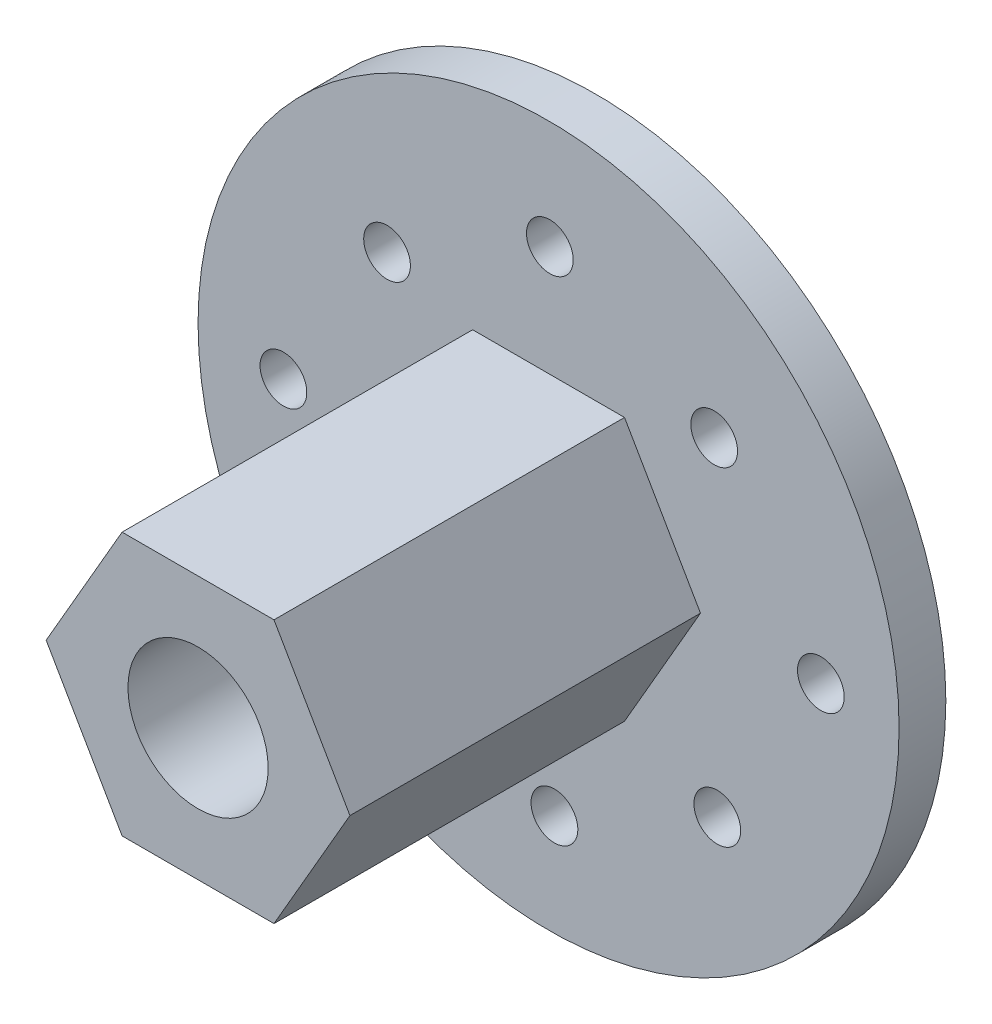
ISO-10303-21;
HEADER;
FILE_DESCRIPTION(('STEP AP214'),'2;1');
FILE_NAME('part.step','',(''),(''),'','','');
FILE_SCHEMA(('AUTOMOTIVE_DESIGN { 1 0 10303 214 1 1 1 1 }'));
ENDSEC;
DATA;
#1=APPLICATION_CONTEXT('core data for automotive mechanical design processes');
#2=APPLICATION_PROTOCOL_DEFINITION('international standard','automotive_design',2000,#1);
#3=PRODUCT_CONTEXT('',#1,'mechanical');
#4=PRODUCT('Part','Part','',(#3));
#5=PRODUCT_RELATED_PRODUCT_CATEGORY('part','',(#4));
#6=PRODUCT_DEFINITION_FORMATION('','',#4);
#7=PRODUCT_DEFINITION_CONTEXT('part definition',#1,'design');
#8=PRODUCT_DEFINITION('design','',#6,#7);
#9=PRODUCT_DEFINITION_SHAPE('','',#8);
#10=(LENGTH_UNIT() NAMED_UNIT(*) SI_UNIT(.MILLI.,.METRE.));
#11=(NAMED_UNIT(*) PLANE_ANGLE_UNIT() SI_UNIT($,.RADIAN.));
#12=(NAMED_UNIT(*) SI_UNIT($,.STERADIAN.) SOLID_ANGLE_UNIT());
#13=UNCERTAINTY_MEASURE_WITH_UNIT(LENGTH_MEASURE(1.E-05),#10,'distance_accuracy_value','');
#14=(GEOMETRIC_REPRESENTATION_CONTEXT(3) GLOBAL_UNCERTAINTY_ASSIGNED_CONTEXT((#13)) GLOBAL_UNIT_ASSIGNED_CONTEXT((#10,
#11,#12)) REPRESENTATION_CONTEXT('',''));
#15=CARTESIAN_POINT('',(0.,0.,0.));
#16=DIRECTION('',(0.,0.,1.));
#17=DIRECTION('',(1.,0.,0.));
#18=AXIS2_PLACEMENT_3D('',#15,#16,#17);
#19=CARTESIAN_POINT('',(0.,-5.62916512459885,15.));
#20=DIRECTION('',(0.,1.,0.));
#21=DIRECTION('',(-1.,0.,0.));
#22=AXIS2_PLACEMENT_3D('',#19,#20,#21);
#23=PLANE('',#22);
#24=DIRECTION('',(1.,0.,0.));
#25=VECTOR('',#24,1.);
#26=CARTESIAN_POINT('',(0.,-5.62916512459885,0.));
#27=LINE('',#26,#25);
#28=CARTESIAN_POINT('',(-3.25,-5.62916512459885,0.));
#29=VERTEX_POINT('',#28);
#30=CARTESIAN_POINT('',(3.25,-5.62916512459885,0.));
#31=VERTEX_POINT('',#30);
#32=EDGE_CURVE('E90',#29,#31,#27,.T.);
#33=ORIENTED_EDGE('',*,*,#32,.T.);
#34=DIRECTION('',(0.,0.,-1.));
#35=VECTOR('',#34,1.);
#36=CARTESIAN_POINT('',(3.25,-5.62916512459885,15.));
#37=LINE('',#36,#35);
#38=CARTESIAN_POINT('',(3.25,-5.62916512459885,15.));
#39=VERTEX_POINT('',#38);
#40=EDGE_CURVE('E11',#39,#31,#37,.T.);
#41=ORIENTED_EDGE('',*,*,#40,.F.);
#42=DIRECTION('',(1.,0.,0.));
#43=VECTOR('',#42,1.);
#44=CARTESIAN_POINT('',(0.,-5.62916512459885,15.));
#45=LINE('',#44,#43);
#46=CARTESIAN_POINT('',(-3.25,-5.62916512459885,15.));
#47=VERTEX_POINT('',#46);
#48=EDGE_CURVE('E142',#47,#39,#45,.T.);
#49=ORIENTED_EDGE('',*,*,#48,.F.);
#50=DIRECTION('',(0.,0.,-1.));
#51=VECTOR('',#50,1.);
#52=CARTESIAN_POINT('',(-3.25,-5.62916512459885,15.));
#53=LINE('',#52,#51);
#54=EDGE_CURVE('E104',#47,#29,#53,.T.);
#55=ORIENTED_EDGE('',*,*,#54,.T.);
#56=EDGE_LOOP('',(#33,#41,#49,#55));
#57=FACE_BOUND('',#56,.T.);
#58=ADVANCED_FACE('F37',(#57),#23,.F.);
#59=CARTESIAN_POINT('',(4.875,-2.81458256229943,15.));
#60=DIRECTION('',(-0.866025403784439,0.5,0.));
#61=DIRECTION('',(-0.5,-0.866025403784439,0.));
#62=AXIS2_PLACEMENT_3D('',#59,#60,#61);
#63=PLANE('',#62);
#64=DIRECTION('',(0.5,0.866025403784439,0.));
#65=VECTOR('',#64,1.);
#66=CARTESIAN_POINT('',(4.875,-2.81458256229943,0.));
#67=LINE('',#66,#65);
#68=CARTESIAN_POINT('',(6.5,0.,0.));
#69=VERTEX_POINT('',#68);
#70=EDGE_CURVE('E86',#31,#69,#67,.T.);
#71=ORIENTED_EDGE('',*,*,#70,.T.);
#72=DIRECTION('',(0.,0.,-1.));
#73=VECTOR('',#72,1.);
#74=CARTESIAN_POINT('',(6.5,0.,15.));
#75=LINE('',#74,#73);
#76=CARTESIAN_POINT('',(6.5,0.,15.));
#77=VERTEX_POINT('',#76);
#78=EDGE_CURVE('E46',#77,#69,#75,.T.);
#79=ORIENTED_EDGE('',*,*,#78,.F.);
#80=DIRECTION('',(0.5,0.866025403784439,0.));
#81=VECTOR('',#80,1.);
#82=CARTESIAN_POINT('',(4.875,-2.81458256229943,15.));
#83=LINE('',#82,#81);
#84=EDGE_CURVE('E100',#39,#77,#83,.T.);
#85=ORIENTED_EDGE('',*,*,#84,.F.);
#86=ORIENTED_EDGE('',*,*,#40,.T.);
#87=EDGE_LOOP('',(#71,#79,#85,#86));
#88=FACE_BOUND('',#87,.T.);
#89=ADVANCED_FACE('F99',(#88),#63,.F.);
#90=CARTESIAN_POINT('',(4.875,2.81458256229943,15.));
#91=DIRECTION('',(-0.866025403784439,-0.5,0.));
#92=DIRECTION('',(0.5,-0.866025403784439,0.));
#93=AXIS2_PLACEMENT_3D('',#90,#91,#92);
#94=PLANE('',#93);
#95=DIRECTION('',(-0.5,0.866025403784439,0.));
#96=VECTOR('',#95,1.);
#97=CARTESIAN_POINT('',(4.875,2.81458256229943,0.));
#98=LINE('',#97,#96);
#99=CARTESIAN_POINT('',(3.25,5.62916512459885,0.));
#100=VERTEX_POINT('',#99);
#101=EDGE_CURVE('E93',#69,#100,#98,.T.);
#102=ORIENTED_EDGE('',*,*,#101,.T.);
#103=DIRECTION('',(0.,0.,-1.));
#104=VECTOR('',#103,1.);
#105=CARTESIAN_POINT('',(3.25,5.62916512459885,15.));
#106=LINE('',#105,#104);
#107=CARTESIAN_POINT('',(3.25,5.62916512459885,15.));
#108=VERTEX_POINT('',#107);
#109=EDGE_CURVE('E130',#108,#100,#106,.T.);
#110=ORIENTED_EDGE('',*,*,#109,.F.);
#111=DIRECTION('',(-0.5,0.866025403784439,0.));
#112=VECTOR('',#111,1.);
#113=CARTESIAN_POINT('',(4.875,2.81458256229943,15.));
#114=LINE('',#113,#112);
#115=EDGE_CURVE('E136',#77,#108,#114,.T.);
#116=ORIENTED_EDGE('',*,*,#115,.F.);
#117=ORIENTED_EDGE('',*,*,#78,.T.);
#118=EDGE_LOOP('',(#102,#110,#116,#117));
#119=FACE_BOUND('',#118,.T.);
#120=ADVANCED_FACE('F134',(#119),#94,.F.);
#121=CARTESIAN_POINT('',(0.,5.62916512459885,15.));
#122=DIRECTION('',(0.,-1.,0.));
#123=DIRECTION('',(1.,0.,0.));
#124=AXIS2_PLACEMENT_3D('',#121,#122,#123);
#125=PLANE('',#124);
#126=DIRECTION('',(-1.,0.,0.));
#127=VECTOR('',#126,1.);
#128=CARTESIAN_POINT('',(0.,5.62916512459885,0.));
#129=LINE('',#128,#127);
#130=CARTESIAN_POINT('',(-3.25,5.62916512459886,0.));
#131=VERTEX_POINT('',#130);
#132=EDGE_CURVE('E114',#100,#131,#129,.T.);
#133=ORIENTED_EDGE('',*,*,#132,.T.);
#134=DIRECTION('',(0.,0.,-1.));
#135=VECTOR('',#134,1.);
#136=CARTESIAN_POINT('',(-3.25,5.62916512459886,15.));
#137=LINE('',#136,#135);
#138=CARTESIAN_POINT('',(-3.25,5.62916512459886,15.));
#139=VERTEX_POINT('',#138);
#140=EDGE_CURVE('E127',#139,#131,#137,.T.);
#141=ORIENTED_EDGE('',*,*,#140,.F.);
#142=DIRECTION('',(-1.,0.,0.));
#143=VECTOR('',#142,1.);
#144=CARTESIAN_POINT('',(0.,5.62916512459885,15.));
#145=LINE('',#144,#143);
#146=EDGE_CURVE('E138',#108,#139,#145,.T.);
#147=ORIENTED_EDGE('',*,*,#146,.F.);
#148=ORIENTED_EDGE('',*,*,#109,.T.);
#149=EDGE_LOOP('',(#133,#141,#147,#148));
#150=FACE_BOUND('',#149,.T.);
#151=ADVANCED_FACE('F236',(#150),#125,.F.);
#152=CARTESIAN_POINT('',(-4.875,2.81458256229943,15.));
#153=DIRECTION('',(0.866025403784439,-0.5,0.));
#154=DIRECTION('',(0.5,0.866025403784439,0.));
#155=AXIS2_PLACEMENT_3D('',#152,#153,#154);
#156=PLANE('',#155);
#157=DIRECTION('',(-0.5,-0.866025403784439,0.));
#158=VECTOR('',#157,1.);
#159=CARTESIAN_POINT('',(-4.875,2.81458256229943,0.));
#160=LINE('',#159,#158);
#161=CARTESIAN_POINT('',(-6.5,0.,0.));
#162=VERTEX_POINT('',#161);
#163=EDGE_CURVE('E117',#131,#162,#160,.T.);
#164=ORIENTED_EDGE('',*,*,#163,.T.);
#165=DIRECTION('',(0.,0.,-1.));
#166=VECTOR('',#165,1.);
#167=CARTESIAN_POINT('',(-6.5,0.,15.));
#168=LINE('',#167,#166);
#169=CARTESIAN_POINT('',(-6.5,0.,15.));
#170=VERTEX_POINT('',#169);
#171=EDGE_CURVE('E124',#170,#162,#168,.T.);
#172=ORIENTED_EDGE('',*,*,#171,.F.);
#173=DIRECTION('',(-0.5,-0.866025403784439,0.));
#174=VECTOR('',#173,1.);
#175=CARTESIAN_POINT('',(-4.875,2.81458256229943,15.));
#176=LINE('',#175,#174);
#177=EDGE_CURVE('E140',#139,#170,#176,.T.);
#178=ORIENTED_EDGE('',*,*,#177,.F.);
#179=ORIENTED_EDGE('',*,*,#140,.T.);
#180=EDGE_LOOP('',(#164,#172,#178,#179));
#181=FACE_BOUND('',#180,.T.);
#182=ADVANCED_FACE('F150',(#181),#156,.F.);
#183=CARTESIAN_POINT('',(0.,0.,15.));
#184=DIRECTION('',(0.,0.,-1.));
#185=DIRECTION('',(-1.,0.,0.));
#186=AXIS2_PLACEMENT_3D('',#183,#184,#185);
#187=CYLINDRICAL_SURFACE('',#186,3.);
#188=CARTESIAN_POINT('',(0.,0.,15.));
#189=DIRECTION('',(0.,0.,1.));
#190=DIRECTION('',(1.,0.,0.));
#191=AXIS2_PLACEMENT_3D('',#188,#189,#190);
#192=CIRCLE('',#191,3.);
#193=CARTESIAN_POINT('',(3.,0.,15.));
#194=VERTEX_POINT('',#193);
#195=EDGE_CURVE('E122',#194,#194,#192,.T.);
#196=ORIENTED_EDGE('',*,*,#195,.T.);
#197=EDGE_LOOP('',(#196));
#198=FACE_BOUND('',#197,.T.);
#199=CARTESIAN_POINT('',(0.,0.,-2.));
#200=DIRECTION('',(0.,0.,-1.));
#201=DIRECTION('',(-1.,0.,0.));
#202=AXIS2_PLACEMENT_3D('',#199,#200,#201);
#203=CIRCLE('',#202,3.);
#204=CARTESIAN_POINT('',(-3.,0.,-2.));
#205=VERTEX_POINT('',#204);
#206=EDGE_CURVE('E157',#205,#205,#203,.T.);
#207=ORIENTED_EDGE('',*,*,#206,.T.);
#208=EDGE_LOOP('',(#207));
#209=FACE_BOUND('',#208,.T.);
#210=ADVANCED_FACE('F39',(#198,#209),#187,.F.);
#211=CARTESIAN_POINT('',(-4.875,-2.81458256229943,15.));
#212=DIRECTION('',(0.866025403784439,0.5,0.));
#213=DIRECTION('',(-0.5,0.866025403784439,0.));
#214=AXIS2_PLACEMENT_3D('',#211,#212,#213);
#215=PLANE('',#214);
#216=DIRECTION('',(0.5,-0.866025403784439,0.));
#217=VECTOR('',#216,1.);
#218=CARTESIAN_POINT('',(-4.875,-2.81458256229943,0.));
#219=LINE('',#218,#217);
#220=EDGE_CURVE('E120',#162,#29,#219,.T.);
#221=ORIENTED_EDGE('',*,*,#220,.T.);
#222=ORIENTED_EDGE('',*,*,#54,.F.);
#223=DIRECTION('',(0.5,-0.866025403784439,0.));
#224=VECTOR('',#223,1.);
#225=CARTESIAN_POINT('',(-4.875,-2.81458256229943,15.));
#226=LINE('',#225,#224);
#227=EDGE_CURVE('E53',#170,#47,#226,.T.);
#228=ORIENTED_EDGE('',*,*,#227,.F.);
#229=ORIENTED_EDGE('',*,*,#171,.T.);
#230=EDGE_LOOP('',(#221,#222,#228,#229));
#231=FACE_BOUND('',#230,.T.);
#232=ADVANCED_FACE('F152',(#231),#215,.F.);
#233=CARTESIAN_POINT('',(0.,0.,15.));
#234=DIRECTION('',(0.,0.,1.));
#235=DIRECTION('',(1.,0.,0.));
#236=AXIS2_PLACEMENT_3D('',#233,#234,#235);
#237=PLANE('',#236);
#238=ORIENTED_EDGE('',*,*,#195,.F.);
#239=EDGE_LOOP('',(#238));
#240=FACE_BOUND('',#239,.T.);
#241=ORIENTED_EDGE('',*,*,#48,.T.);
#242=ORIENTED_EDGE('',*,*,#84,.T.);
#243=ORIENTED_EDGE('',*,*,#115,.T.);
#244=ORIENTED_EDGE('',*,*,#146,.T.);
#245=ORIENTED_EDGE('',*,*,#177,.T.);
#246=ORIENTED_EDGE('',*,*,#227,.T.);
#247=EDGE_LOOP('',(#241,#242,#243,#244,#245,#246));
#248=FACE_BOUND('',#247,.T.);
#249=ADVANCED_FACE('F147',(#240,#248),#237,.T.);
#250=CARTESIAN_POINT('',(0.,0.,-2.));
#251=DIRECTION('',(0.,0.,-1.));
#252=DIRECTION('',(-1.,0.,0.));
#253=AXIS2_PLACEMENT_3D('',#250,#251,#252);
#254=PLANE('',#253);
#255=CARTESIAN_POINT('',(11.6522170307561,-0.0320928259493563,-2.));
#256=DIRECTION('',(0.,0.,-1.));
#257=DIRECTION('',(-1.,0.,0.));
#258=AXIS2_PLACEMENT_3D('',#255,#256,#257);
#259=CIRCLE('',#258,1.00000000000001);
#260=CARTESIAN_POINT('',(10.6522170307561,-0.0320928259493563,-2.));
#261=VERTEX_POINT('',#260);
#262=EDGE_CURVE('E195',#261,#261,#259,.T.);
#263=ORIENTED_EDGE('',*,*,#262,.F.);
#264=EDGE_LOOP('',(#263));
#265=FACE_BOUND('',#264,.T.);
#266=CARTESIAN_POINT('',(0.250519229633012,-10.638767200353,-2.));
#267=DIRECTION('',(0.,0.,-1.));
#268=DIRECTION('',(-1.,0.,0.));
#269=AXIS2_PLACEMENT_3D('',#266,#267,#268);
#270=CIRCLE('',#269,1.00000000000001);
#271=CARTESIAN_POINT('',(-0.749480770366994,-10.638767200353,-2.));
#272=VERTEX_POINT('',#271);
#273=EDGE_CURVE('E183',#272,#272,#270,.T.);
#274=ORIENTED_EDGE('',*,*,#273,.F.);
#275=EDGE_LOOP('',(#274));
#276=FACE_BOUND('',#275,.T.);
#277=CARTESIAN_POINT('',(-11.3467825963889,-0.246606579139946,-2.));
#278=DIRECTION('',(0.,0.,-1.));
#279=DIRECTION('',(-1.,0.,0.));
#280=AXIS2_PLACEMENT_3D('',#277,#278,#279);
#281=CIRCLE('',#280,0.999999999999991);
#282=CARTESIAN_POINT('',(-12.3467825963889,-0.246606579139946,-2.));
#283=VERTEX_POINT('',#282);
#284=EDGE_CURVE('E171',#283,#283,#281,.T.);
#285=ORIENTED_EDGE('',*,*,#284,.F.);
#286=EDGE_LOOP('',(#285));
#287=FACE_BOUND('',#286,.T.);
#288=CARTESIAN_POINT('',(0.0546588462850758,10.3603194157364,-2.));
#289=DIRECTION('',(0.,0.,-1.));
#290=DIRECTION('',(-1.,0.,0.));
#291=AXIS2_PLACEMENT_3D('',#288,#289,#290);
#292=CIRCLE('',#291,1.00000000000001);
#293=CARTESIAN_POINT('',(-0.945341153714929,10.3603194157364,-2.));
#294=VERTEX_POINT('',#293);
#295=EDGE_CURVE('E161',#294,#294,#292,.T.);
#296=ORIENTED_EDGE('',*,*,#295,.F.);
#297=EDGE_LOOP('',(#296));
#298=FACE_BOUND('',#297,.T.);
#299=CARTESIAN_POINT('',(0.,0.,-2.));
#300=DIRECTION('',(0.,0.,-1.));
#301=DIRECTION('',(-1.,0.,0.));
#302=AXIS2_PLACEMENT_3D('',#299,#300,#301);
#303=CIRCLE('',#302,15.);
#304=CARTESIAN_POINT('',(-15.,0.,-2.));
#305=VERTEX_POINT('',#304);
#306=EDGE_CURVE('E105',#305,#305,#303,.T.);
#307=ORIENTED_EDGE('',*,*,#306,.T.);
#308=EDGE_LOOP('',(#307));
#309=FACE_BOUND('',#308,.T.);
#310=ORIENTED_EDGE('',*,*,#206,.F.);
#311=EDGE_LOOP('',(#310));
#312=FACE_BOUND('',#311,.T.);
#313=CARTESIAN_POINT('',(-6.91220148410217,6.66790971138448,-2.));
#314=DIRECTION('',(0.,0.,-1.));
#315=DIRECTION('',(-1.,0.,0.));
#316=AXIS2_PLACEMENT_3D('',#313,#314,#315);
#317=CIRCLE('',#316,0.999999999999998);
#318=CARTESIAN_POINT('',(-7.91220148410217,6.66790971138448,-2.));
#319=VERTEX_POINT('',#318);
#320=EDGE_CURVE('E165',#319,#319,#317,.T.);
#321=ORIENTED_EDGE('',*,*,#320,.F.);
#322=EDGE_LOOP('',(#321));
#323=FACE_BOUND('',#322,.T.);
#324=CARTESIAN_POINT('',(-6.77985788851077,-7.33189268353036,-2.));
#325=DIRECTION('',(0.,0.,-1.));
#326=DIRECTION('',(-1.,0.,0.));
#327=AXIS2_PLACEMENT_3D('',#324,#325,#326);
#328=CIRCLE('',#327,1.);
#329=CARTESIAN_POINT('',(-7.77985788851077,-7.33189268353036,-2.));
#330=VERTEX_POINT('',#329);
#331=EDGE_CURVE('E177',#330,#330,#328,.T.);
#332=ORIENTED_EDGE('',*,*,#331,.F.);
#333=EDGE_LOOP('',(#332));
#334=FACE_BOUND('',#333,.T.);
#335=CARTESIAN_POINT('',(7.22010411117972,-7.20099369873894,-2.));
#336=DIRECTION('',(0.,0.,-1.));
#337=DIRECTION('',(-1.,0.,0.));
#338=AXIS2_PLACEMENT_3D('',#335,#336,#337);
#339=CIRCLE('',#338,1.00000000000001);
#340=CARTESIAN_POINT('',(6.22010411117971,-7.20099369873894,-2.));
#341=VERTEX_POINT('',#340);
#342=EDGE_CURVE('E189',#341,#341,#339,.T.);
#343=ORIENTED_EDGE('',*,*,#342,.F.);
#344=EDGE_LOOP('',(#343));
#345=FACE_BOUND('',#344,.T.);
#346=CARTESIAN_POINT('',(7.08702453817596,6.7958283021871,-2.));
#347=DIRECTION('',(0.,0.,-1.));
#348=DIRECTION('',(-1.,0.,0.));
#349=AXIS2_PLACEMENT_3D('',#346,#347,#348);
#350=CIRCLE('',#349,1.00000000000001);
#351=CARTESIAN_POINT('',(6.08702453817595,6.7958283021871,-2.));
#352=VERTEX_POINT('',#351);
#353=EDGE_CURVE('E201',#352,#352,#350,.T.);
#354=ORIENTED_EDGE('',*,*,#353,.F.);
#355=EDGE_LOOP('',(#354));
#356=FACE_BOUND('',#355,.T.);
#357=ADVANCED_FACE('F213',(#265,#276,#287,#298,#309,#312,#323,#334,#345,#356),#254,.T.);
#358=CARTESIAN_POINT('',(0.,0.,0.));
#359=DIRECTION('',(0.,0.,-1.));
#360=DIRECTION('',(-1.,0.,0.));
#361=AXIS2_PLACEMENT_3D('',#358,#359,#360);
#362=PLANE('',#361);
#363=ORIENTED_EDGE('',*,*,#32,.F.);
#364=ORIENTED_EDGE('',*,*,#220,.F.);
#365=ORIENTED_EDGE('',*,*,#163,.F.);
#366=ORIENTED_EDGE('',*,*,#132,.F.);
#367=ORIENTED_EDGE('',*,*,#101,.F.);
#368=ORIENTED_EDGE('',*,*,#70,.F.);
#369=EDGE_LOOP('',(#363,#364,#365,#366,#367,#368));
#370=FACE_BOUND('',#369,.T.);
#371=CARTESIAN_POINT('',(0.,0.,0.));
#372=DIRECTION('',(0.,0.,-1.));
#373=DIRECTION('',(-1.,0.,0.));
#374=AXIS2_PLACEMENT_3D('',#371,#372,#373);
#375=CIRCLE('',#374,15.);
#376=CARTESIAN_POINT('',(-15.,0.,0.));
#377=VERTEX_POINT('',#376);
#378=EDGE_CURVE('E108',#377,#377,#375,.T.);
#379=ORIENTED_EDGE('',*,*,#378,.F.);
#380=EDGE_LOOP('',(#379));
#381=FACE_BOUND('',#380,.T.);
#382=CARTESIAN_POINT('',(0.0546588462850758,10.3603194157364,0.));
#383=DIRECTION('',(0.,0.,-1.));
#384=DIRECTION('',(-1.,0.,0.));
#385=AXIS2_PLACEMENT_3D('',#382,#383,#384);
#386=CIRCLE('',#385,1.00000000000001);
#387=CARTESIAN_POINT('',(-0.945341153714929,10.3603194157364,0.));
#388=VERTEX_POINT('',#387);
#389=EDGE_CURVE('E162',#388,#388,#386,.T.);
#390=ORIENTED_EDGE('',*,*,#389,.T.);
#391=EDGE_LOOP('',(#390));
#392=FACE_BOUND('',#391,.T.);
#393=CARTESIAN_POINT('',(-6.91220148410217,6.66790971138448,0.));
#394=DIRECTION('',(0.,0.,-1.));
#395=DIRECTION('',(-1.,0.,0.));
#396=AXIS2_PLACEMENT_3D('',#393,#394,#395);
#397=CIRCLE('',#396,0.999999999999998);
#398=CARTESIAN_POINT('',(-7.91220148410217,6.66790971138448,0.));
#399=VERTEX_POINT('',#398);
#400=EDGE_CURVE('E168',#399,#399,#397,.T.);
#401=ORIENTED_EDGE('',*,*,#400,.T.);
#402=EDGE_LOOP('',(#401));
#403=FACE_BOUND('',#402,.T.);
#404=CARTESIAN_POINT('',(-11.3467825963889,-0.246606579139946,0.));
#405=DIRECTION('',(0.,0.,-1.));
#406=DIRECTION('',(-1.,0.,0.));
#407=AXIS2_PLACEMENT_3D('',#404,#405,#406);
#408=CIRCLE('',#407,0.999999999999991);
#409=CARTESIAN_POINT('',(-12.3467825963889,-0.246606579139946,0.));
#410=VERTEX_POINT('',#409);
#411=EDGE_CURVE('E174',#410,#410,#408,.T.);
#412=ORIENTED_EDGE('',*,*,#411,.T.);
#413=EDGE_LOOP('',(#412));
#414=FACE_BOUND('',#413,.T.);
#415=CARTESIAN_POINT('',(-6.77985788851077,-7.33189268353036,0.));
#416=DIRECTION('',(0.,0.,-1.));
#417=DIRECTION('',(-1.,0.,0.));
#418=AXIS2_PLACEMENT_3D('',#415,#416,#417);
#419=CIRCLE('',#418,1.);
#420=CARTESIAN_POINT('',(-7.77985788851077,-7.33189268353036,0.));
#421=VERTEX_POINT('',#420);
#422=EDGE_CURVE('E180',#421,#421,#419,.T.);
#423=ORIENTED_EDGE('',*,*,#422,.T.);
#424=EDGE_LOOP('',(#423));
#425=FACE_BOUND('',#424,.T.);
#426=CARTESIAN_POINT('',(0.250519229633012,-10.638767200353,0.));
#427=DIRECTION('',(0.,0.,-1.));
#428=DIRECTION('',(-1.,0.,0.));
#429=AXIS2_PLACEMENT_3D('',#426,#427,#428);
#430=CIRCLE('',#429,1.00000000000001);
#431=CARTESIAN_POINT('',(-0.749480770366994,-10.638767200353,0.));
#432=VERTEX_POINT('',#431);
#433=EDGE_CURVE('E186',#432,#432,#430,.T.);
#434=ORIENTED_EDGE('',*,*,#433,.T.);
#435=EDGE_LOOP('',(#434));
#436=FACE_BOUND('',#435,.T.);
#437=CARTESIAN_POINT('',(7.22010411117972,-7.20099369873894,0.));
#438=DIRECTION('',(0.,0.,-1.));
#439=DIRECTION('',(-1.,0.,0.));
#440=AXIS2_PLACEMENT_3D('',#437,#438,#439);
#441=CIRCLE('',#440,1.00000000000001);
#442=CARTESIAN_POINT('',(6.22010411117971,-7.20099369873894,0.));
#443=VERTEX_POINT('',#442);
#444=EDGE_CURVE('E192',#443,#443,#441,.T.);
#445=ORIENTED_EDGE('',*,*,#444,.T.);
#446=EDGE_LOOP('',(#445));
#447=FACE_BOUND('',#446,.T.);
#448=CARTESIAN_POINT('',(11.6522170307561,-0.0320928259493563,0.));
#449=DIRECTION('',(0.,0.,-1.));
#450=DIRECTION('',(-1.,0.,0.));
#451=AXIS2_PLACEMENT_3D('',#448,#449,#450);
#452=CIRCLE('',#451,1.00000000000001);
#453=CARTESIAN_POINT('',(10.6522170307561,-0.0320928259493563,0.));
#454=VERTEX_POINT('',#453);
#455=EDGE_CURVE('E198',#454,#454,#452,.T.);
#456=ORIENTED_EDGE('',*,*,#455,.T.);
#457=EDGE_LOOP('',(#456));
#458=FACE_BOUND('',#457,.T.);
#459=CARTESIAN_POINT('',(7.08702453817596,6.7958283021871,0.));
#460=DIRECTION('',(0.,0.,-1.));
#461=DIRECTION('',(-1.,0.,0.));
#462=AXIS2_PLACEMENT_3D('',#459,#460,#461);
#463=CIRCLE('',#462,1.00000000000001);
#464=CARTESIAN_POINT('',(6.08702453817595,6.7958283021871,0.));
#465=VERTEX_POINT('',#464);
#466=EDGE_CURVE('E204',#465,#465,#463,.T.);
#467=ORIENTED_EDGE('',*,*,#466,.T.);
#468=EDGE_LOOP('',(#467));
#469=FACE_BOUND('',#468,.T.);
#470=ADVANCED_FACE('F87',(#370,#381,#392,#403,#414,#425,#436,#447,#458,#469),#362,.F.);
#471=CARTESIAN_POINT('',(0.,0.,-2.));
#472=DIRECTION('',(0.,0.,1.));
#473=DIRECTION('',(1.,0.,0.));
#474=AXIS2_PLACEMENT_3D('',#471,#472,#473);
#475=CYLINDRICAL_SURFACE('',#474,15.);
#476=ORIENTED_EDGE('',*,*,#306,.F.);
#477=EDGE_LOOP('',(#476));
#478=FACE_BOUND('',#477,.T.);
#479=ORIENTED_EDGE('',*,*,#378,.T.);
#480=EDGE_LOOP('',(#479));
#481=FACE_BOUND('',#480,.T.);
#482=ADVANCED_FACE('F221',(#478,#481),#475,.T.);
#483=CARTESIAN_POINT('',(0.0546588462850758,10.3603194157364,-2.));
#484=DIRECTION('',(0.,0.,1.));
#485=DIRECTION('',(1.,0.,0.));
#486=AXIS2_PLACEMENT_3D('',#483,#484,#485);
#487=CYLINDRICAL_SURFACE('',#486,1.00000000000001);
#488=ORIENTED_EDGE('',*,*,#295,.T.);
#489=EDGE_LOOP('',(#488));
#490=FACE_BOUND('',#489,.T.);
#491=ORIENTED_EDGE('',*,*,#389,.F.);
#492=EDGE_LOOP('',(#491));
#493=FACE_BOUND('',#492,.T.);
#494=ADVANCED_FACE('F245',(#490,#493),#487,.F.);
#495=CARTESIAN_POINT('',(-6.91220148410217,6.66790971138448,-2.));
#496=DIRECTION('',(0.,0.,1.));
#497=DIRECTION('',(1.,0.,0.));
#498=AXIS2_PLACEMENT_3D('',#495,#496,#497);
#499=CYLINDRICAL_SURFACE('',#498,0.999999999999998);
#500=ORIENTED_EDGE('',*,*,#320,.T.);
#501=EDGE_LOOP('',(#500));
#502=FACE_BOUND('',#501,.T.);
#503=ORIENTED_EDGE('',*,*,#400,.F.);
#504=EDGE_LOOP('',(#503));
#505=FACE_BOUND('',#504,.T.);
#506=ADVANCED_FACE('F250',(#502,#505),#499,.F.);
#507=CARTESIAN_POINT('',(-11.3467825963889,-0.246606579139946,-2.));
#508=DIRECTION('',(0.,0.,1.));
#509=DIRECTION('',(1.,0.,0.));
#510=AXIS2_PLACEMENT_3D('',#507,#508,#509);
#511=CYLINDRICAL_SURFACE('',#510,0.999999999999991);
#512=ORIENTED_EDGE('',*,*,#284,.T.);
#513=EDGE_LOOP('',(#512));
#514=FACE_BOUND('',#513,.T.);
#515=ORIENTED_EDGE('',*,*,#411,.F.);
#516=EDGE_LOOP('',(#515));
#517=FACE_BOUND('',#516,.T.);
#518=ADVANCED_FACE('F291',(#514,#517),#511,.F.);
#519=CARTESIAN_POINT('',(-6.77985788851077,-7.33189268353036,-2.));
#520=DIRECTION('',(0.,0.,1.));
#521=DIRECTION('',(1.,0.,0.));
#522=AXIS2_PLACEMENT_3D('',#519,#520,#521);
#523=CYLINDRICAL_SURFACE('',#522,1.);
#524=ORIENTED_EDGE('',*,*,#331,.T.);
#525=EDGE_LOOP('',(#524));
#526=FACE_BOUND('',#525,.T.);
#527=ORIENTED_EDGE('',*,*,#422,.F.);
#528=EDGE_LOOP('',(#527));
#529=FACE_BOUND('',#528,.T.);
#530=ADVANCED_FACE('F287',(#526,#529),#523,.F.);
#531=CARTESIAN_POINT('',(0.250519229633012,-10.638767200353,-2.));
#532=DIRECTION('',(0.,0.,1.));
#533=DIRECTION('',(1.,0.,0.));
#534=AXIS2_PLACEMENT_3D('',#531,#532,#533);
#535=CYLINDRICAL_SURFACE('',#534,1.00000000000001);
#536=ORIENTED_EDGE('',*,*,#273,.T.);
#537=EDGE_LOOP('',(#536));
#538=FACE_BOUND('',#537,.T.);
#539=ORIENTED_EDGE('',*,*,#433,.F.);
#540=EDGE_LOOP('',(#539));
#541=FACE_BOUND('',#540,.T.);
#542=ADVANCED_FACE('F283',(#538,#541),#535,.F.);
#543=CARTESIAN_POINT('',(7.22010411117972,-7.20099369873894,-2.));
#544=DIRECTION('',(0.,0.,1.));
#545=DIRECTION('',(1.,0.,0.));
#546=AXIS2_PLACEMENT_3D('',#543,#544,#545);
#547=CYLINDRICAL_SURFACE('',#546,1.00000000000001);
#548=ORIENTED_EDGE('',*,*,#342,.T.);
#549=EDGE_LOOP('',(#548));
#550=FACE_BOUND('',#549,.T.);
#551=ORIENTED_EDGE('',*,*,#444,.F.);
#552=EDGE_LOOP('',(#551));
#553=FACE_BOUND('',#552,.T.);
#554=ADVANCED_FACE('F277',(#550,#553),#547,.F.);
#555=CARTESIAN_POINT('',(11.6522170307561,-0.0320928259493563,-2.));
#556=DIRECTION('',(0.,0.,1.));
#557=DIRECTION('',(1.,0.,0.));
#558=AXIS2_PLACEMENT_3D('',#555,#556,#557);
#559=CYLINDRICAL_SURFACE('',#558,1.00000000000001);
#560=ORIENTED_EDGE('',*,*,#262,.T.);
#561=EDGE_LOOP('',(#560));
#562=FACE_BOUND('',#561,.T.);
#563=ORIENTED_EDGE('',*,*,#455,.F.);
#564=EDGE_LOOP('',(#563));
#565=FACE_BOUND('',#564,.T.);
#566=ADVANCED_FACE('F272',(#562,#565),#559,.F.);
#567=CARTESIAN_POINT('',(7.08702453817596,6.7958283021871,-2.));
#568=DIRECTION('',(0.,0.,1.));
#569=DIRECTION('',(1.,0.,0.));
#570=AXIS2_PLACEMENT_3D('',#567,#568,#569);
#571=CYLINDRICAL_SURFACE('',#570,1.00000000000001);
#572=ORIENTED_EDGE('',*,*,#353,.T.);
#573=EDGE_LOOP('',(#572));
#574=FACE_BOUND('',#573,.T.);
#575=ORIENTED_EDGE('',*,*,#466,.F.);
#576=EDGE_LOOP('',(#575));
#577=FACE_BOUND('',#576,.T.);
#578=ADVANCED_FACE('F210',(#574,#577),#571,.F.);
#579=CLOSED_SHELL('',(#58,#89,#120,#151,#182,#210,#232,#249,#357,#470,#482,#494,#506,#518,#530,
#542,#554,#566,#578));
#580=MANIFOLD_SOLID_BREP('B2',#579);
#581=ADVANCED_BREP_SHAPE_REPRESENTATION('',(#18,#580),#14);
#582=SHAPE_DEFINITION_REPRESENTATION(#9,#581);
ENDSEC;
END-ISO-10303-21;
